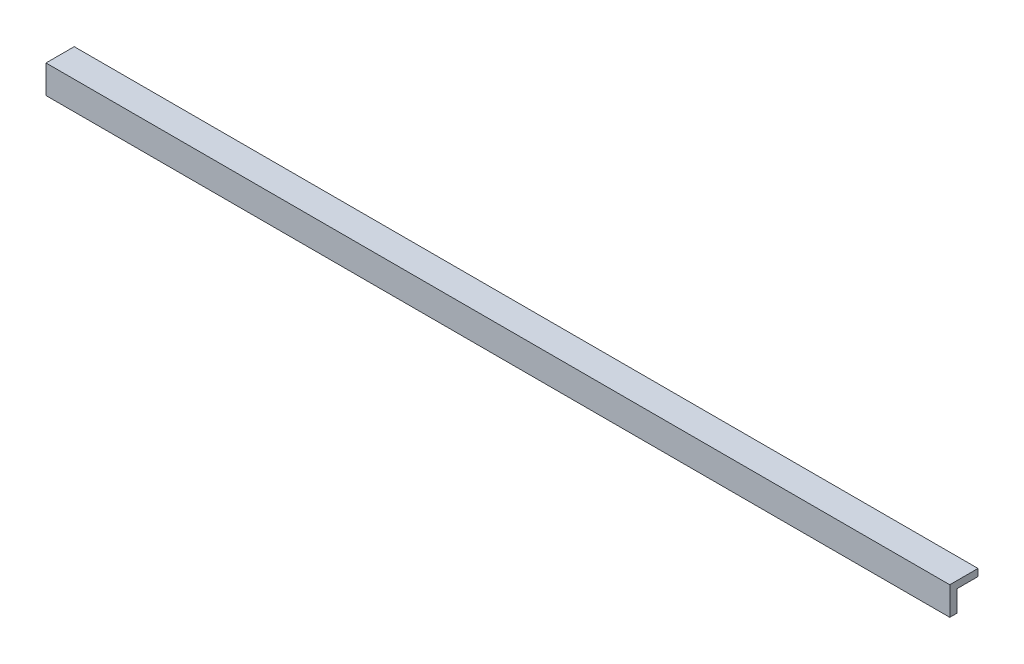
ISO-10303-21;
HEADER;
FILE_DESCRIPTION(('STEP AP214'),'2;1');
FILE_NAME('part.step','',(''),(''),'','','');
FILE_SCHEMA(('AUTOMOTIVE_DESIGN { 1 0 10303 214 1 1 1 1 }'));
ENDSEC;
DATA;
#1=APPLICATION_CONTEXT('core data for automotive mechanical design processes');
#2=APPLICATION_PROTOCOL_DEFINITION('international standard','automotive_design',2000,#1);
#3=PRODUCT_CONTEXT('',#1,'mechanical');
#4=PRODUCT('Part','Part','',(#3));
#5=PRODUCT_RELATED_PRODUCT_CATEGORY('part','',(#4));
#6=PRODUCT_DEFINITION_FORMATION('','',#4);
#7=PRODUCT_DEFINITION_CONTEXT('part definition',#1,'design');
#8=PRODUCT_DEFINITION('design','',#6,#7);
#9=PRODUCT_DEFINITION_SHAPE('','',#8);
#10=(LENGTH_UNIT() NAMED_UNIT(*) SI_UNIT(.MILLI.,.METRE.));
#11=(NAMED_UNIT(*) PLANE_ANGLE_UNIT() SI_UNIT($,.RADIAN.));
#12=(NAMED_UNIT(*) SI_UNIT($,.STERADIAN.) SOLID_ANGLE_UNIT());
#13=UNCERTAINTY_MEASURE_WITH_UNIT(LENGTH_MEASURE(1.E-05),#10,'distance_accuracy_value','');
#14=(GEOMETRIC_REPRESENTATION_CONTEXT(3) GLOBAL_UNCERTAINTY_ASSIGNED_CONTEXT((#13)) GLOBAL_UNIT_ASSIGNED_CONTEXT((#10,
#11,#12)) REPRESENTATION_CONTEXT('',''));
#15=CARTESIAN_POINT('',(0.,0.,0.));
#16=DIRECTION('',(0.,0.,1.));
#17=DIRECTION('',(1.,0.,0.));
#18=AXIS2_PLACEMENT_3D('',#15,#16,#17);
#19=CARTESIAN_POINT('',(203.2,0.,-1.5875));
#20=DIRECTION('',(0.,1.,0.));
#21=DIRECTION('',(0.,0.,1.));
#22=AXIS2_PLACEMENT_3D('',#19,#20,#21);
#23=PLANE('',#22);
#24=DIRECTION('',(0.,0.,-1.));
#25=VECTOR('',#24,1.);
#26=CARTESIAN_POINT('',(0.,0.,-1.5875));
#27=LINE('',#26,#25);
#28=CARTESIAN_POINT('',(0.,0.,0.));
#29=VERTEX_POINT('',#28);
#30=CARTESIAN_POINT('',(0.,0.,-1.5875));
#31=VERTEX_POINT('',#30);
#32=EDGE_CURVE('E143',#29,#31,#27,.T.);
#33=ORIENTED_EDGE('',*,*,#32,.T.);
#34=DIRECTION('',(-1.,0.,0.));
#35=VECTOR('',#34,1.);
#36=CARTESIAN_POINT('',(203.2,0.,-1.5875));
#37=LINE('',#36,#35);
#38=CARTESIAN_POINT('',(203.2,0.,-1.5875));
#39=VERTEX_POINT('',#38);
#40=EDGE_CURVE('E11',#39,#31,#37,.T.);
#41=ORIENTED_EDGE('',*,*,#40,.F.);
#42=DIRECTION('',(0.,0.,-1.));
#43=VECTOR('',#42,1.);
#44=CARTESIAN_POINT('',(203.2,0.,-1.5875));
#45=LINE('',#44,#43);
#46=CARTESIAN_POINT('',(203.2,0.,0.));
#47=VERTEX_POINT('',#46);
#48=EDGE_CURVE('E159',#47,#39,#45,.T.);
#49=ORIENTED_EDGE('',*,*,#48,.F.);
#50=DIRECTION('',(-1.,0.,0.));
#51=VECTOR('',#50,1.);
#52=CARTESIAN_POINT('',(203.2,0.,0.));
#53=LINE('',#52,#51);
#54=EDGE_CURVE('E139',#47,#29,#53,.T.);
#55=ORIENTED_EDGE('',*,*,#54,.T.);
#56=EDGE_LOOP('',(#33,#41,#49,#55));
#57=FACE_BOUND('',#56,.T.);
#58=ADVANCED_FACE('F41',(#57),#23,.F.);
#59=CARTESIAN_POINT('',(203.2,4.7625,-1.5875));
#60=DIRECTION('',(0.,0.,1.));
#61=DIRECTION('',(0.,-1.,0.));
#62=AXIS2_PLACEMENT_3D('',#59,#60,#61);
#63=PLANE('',#62);
#64=DIRECTION('',(0.,1.,0.));
#65=VECTOR('',#64,1.);
#66=CARTESIAN_POINT('',(0.,4.7625,-1.5875));
#67=LINE('',#66,#65);
#68=CARTESIAN_POINT('',(0.,4.7625,-1.5875));
#69=VERTEX_POINT('',#68);
#70=EDGE_CURVE('E147',#31,#69,#67,.T.);
#71=ORIENTED_EDGE('',*,*,#70,.T.);
#72=DIRECTION('',(-1.,0.,0.));
#73=VECTOR('',#72,1.);
#74=CARTESIAN_POINT('',(203.2,4.7625,-1.5875));
#75=LINE('',#74,#73);
#76=CARTESIAN_POINT('',(203.2,4.7625,-1.5875));
#77=VERTEX_POINT('',#76);
#78=EDGE_CURVE('E50',#77,#69,#75,.T.);
#79=ORIENTED_EDGE('',*,*,#78,.F.);
#80=DIRECTION('',(0.,1.,0.));
#81=VECTOR('',#80,1.);
#82=CARTESIAN_POINT('',(203.2,4.7625,-1.5875));
#83=LINE('',#82,#81);
#84=EDGE_CURVE('E106',#39,#77,#83,.T.);
#85=ORIENTED_EDGE('',*,*,#84,.F.);
#86=ORIENTED_EDGE('',*,*,#40,.T.);
#87=EDGE_LOOP('',(#71,#79,#85,#86));
#88=FACE_BOUND('',#87,.T.);
#89=ADVANCED_FACE('F187',(#88),#63,.F.);
#90=CARTESIAN_POINT('',(203.2,4.7625,-6.35));
#91=DIRECTION('',(0.,1.,0.));
#92=DIRECTION('',(0.,0.,1.));
#93=AXIS2_PLACEMENT_3D('',#90,#91,#92);
#94=PLANE('',#93);
#95=DIRECTION('',(0.,0.,-1.));
#96=VECTOR('',#95,1.);
#97=CARTESIAN_POINT('',(0.,4.7625,-6.35));
#98=LINE('',#97,#96);
#99=CARTESIAN_POINT('',(0.,4.7625,-6.35));
#100=VERTEX_POINT('',#99);
#101=EDGE_CURVE('E150',#69,#100,#98,.T.);
#102=ORIENTED_EDGE('',*,*,#101,.T.);
#103=DIRECTION('',(-1.,0.,0.));
#104=VECTOR('',#103,1.);
#105=CARTESIAN_POINT('',(203.2,4.7625,-6.35));
#106=LINE('',#105,#104);
#107=CARTESIAN_POINT('',(203.2,4.7625,-6.35));
#108=VERTEX_POINT('',#107);
#109=EDGE_CURVE('E131',#108,#100,#106,.T.);
#110=ORIENTED_EDGE('',*,*,#109,.F.);
#111=DIRECTION('',(0.,0.,-1.));
#112=VECTOR('',#111,1.);
#113=CARTESIAN_POINT('',(203.2,4.7625,-6.35));
#114=LINE('',#113,#112);
#115=EDGE_CURVE('E120',#77,#108,#114,.T.);
#116=ORIENTED_EDGE('',*,*,#115,.F.);
#117=ORIENTED_EDGE('',*,*,#78,.T.);
#118=EDGE_LOOP('',(#102,#110,#116,#117));
#119=FACE_BOUND('',#118,.T.);
#120=ADVANCED_FACE('F169',(#119),#94,.F.);
#121=CARTESIAN_POINT('',(203.2,6.35,-6.35));
#122=DIRECTION('',(0.,0.,1.));
#123=DIRECTION('',(1.,0.,0.));
#124=AXIS2_PLACEMENT_3D('',#121,#122,#123);
#125=PLANE('',#124);
#126=DIRECTION('',(0.,1.,0.));
#127=VECTOR('',#126,1.);
#128=CARTESIAN_POINT('',(0.,6.35,-6.35));
#129=LINE('',#128,#127);
#130=CARTESIAN_POINT('',(0.,6.35,-6.35));
#131=VERTEX_POINT('',#130);
#132=EDGE_CURVE('E129',#100,#131,#129,.T.);
#133=ORIENTED_EDGE('',*,*,#132,.T.);
#134=DIRECTION('',(-1.,0.,0.));
#135=VECTOR('',#134,1.);
#136=CARTESIAN_POINT('',(203.2,6.35,-6.35));
#137=LINE('',#136,#135);
#138=CARTESIAN_POINT('',(203.2,6.35,-6.35));
#139=VERTEX_POINT('',#138);
#140=EDGE_CURVE('E126',#139,#131,#137,.T.);
#141=ORIENTED_EDGE('',*,*,#140,.F.);
#142=DIRECTION('',(0.,1.,0.));
#143=VECTOR('',#142,1.);
#144=CARTESIAN_POINT('',(203.2,6.35,-6.35));
#145=LINE('',#144,#143);
#146=EDGE_CURVE('E114',#108,#139,#145,.T.);
#147=ORIENTED_EDGE('',*,*,#146,.F.);
#148=ORIENTED_EDGE('',*,*,#109,.T.);
#149=EDGE_LOOP('',(#133,#141,#147,#148));
#150=FACE_BOUND('',#149,.T.);
#151=ADVANCED_FACE('F127',(#150),#125,.F.);
#152=CARTESIAN_POINT('',(203.2,6.35,0.));
#153=DIRECTION('',(0.,-1.,0.));
#154=DIRECTION('',(0.,0.,-1.));
#155=AXIS2_PLACEMENT_3D('',#152,#153,#154);
#156=PLANE('',#155);
#157=DIRECTION('',(0.,0.,1.));
#158=VECTOR('',#157,1.);
#159=CARTESIAN_POINT('',(0.,6.35,0.));
#160=LINE('',#159,#158);
#161=CARTESIAN_POINT('',(0.,6.35,0.));
#162=VERTEX_POINT('',#161);
#163=EDGE_CURVE('E89',#131,#162,#160,.T.);
#164=ORIENTED_EDGE('',*,*,#163,.T.);
#165=DIRECTION('',(-1.,0.,0.));
#166=VECTOR('',#165,1.);
#167=CARTESIAN_POINT('',(203.2,6.35,0.));
#168=LINE('',#167,#166);
#169=CARTESIAN_POINT('',(203.2,6.35,0.));
#170=VERTEX_POINT('',#169);
#171=EDGE_CURVE('E132',#170,#162,#168,.T.);
#172=ORIENTED_EDGE('',*,*,#171,.F.);
#173=DIRECTION('',(0.,0.,1.));
#174=VECTOR('',#173,1.);
#175=CARTESIAN_POINT('',(203.2,6.35,0.));
#176=LINE('',#175,#174);
#177=EDGE_CURVE('E118',#139,#170,#176,.T.);
#178=ORIENTED_EDGE('',*,*,#177,.F.);
#179=ORIENTED_EDGE('',*,*,#140,.T.);
#180=EDGE_LOOP('',(#164,#172,#178,#179));
#181=FACE_BOUND('',#180,.T.);
#182=ADVANCED_FACE('F134',(#181),#156,.F.);
#183=CARTESIAN_POINT('',(203.2,0.,0.));
#184=DIRECTION('',(0.,0.,-1.));
#185=DIRECTION('',(-1.,0.,0.));
#186=AXIS2_PLACEMENT_3D('',#183,#184,#185);
#187=PLANE('',#186);
#188=DIRECTION('',(0.,-1.,0.));
#189=VECTOR('',#188,1.);
#190=CARTESIAN_POINT('',(0.,0.,0.));
#191=LINE('',#190,#189);
#192=EDGE_CURVE('E96',#162,#29,#191,.T.);
#193=ORIENTED_EDGE('',*,*,#192,.T.);
#194=ORIENTED_EDGE('',*,*,#54,.F.);
#195=DIRECTION('',(0.,-1.,0.));
#196=VECTOR('',#195,1.);
#197=CARTESIAN_POINT('',(203.2,0.,0.));
#198=LINE('',#197,#196);
#199=EDGE_CURVE('E61',#170,#47,#198,.T.);
#200=ORIENTED_EDGE('',*,*,#199,.F.);
#201=ORIENTED_EDGE('',*,*,#171,.T.);
#202=EDGE_LOOP('',(#193,#194,#200,#201));
#203=FACE_BOUND('',#202,.T.);
#204=ADVANCED_FACE('F176',(#203),#187,.F.);
#205=CARTESIAN_POINT('',(203.2,0.,0.));
#206=DIRECTION('',(-1.,0.,0.));
#207=DIRECTION('',(0.,0.,1.));
#208=AXIS2_PLACEMENT_3D('',#205,#206,#207);
#209=PLANE('',#208);
#210=ORIENTED_EDGE('',*,*,#48,.T.);
#211=ORIENTED_EDGE('',*,*,#84,.T.);
#212=ORIENTED_EDGE('',*,*,#115,.T.);
#213=ORIENTED_EDGE('',*,*,#146,.T.);
#214=ORIENTED_EDGE('',*,*,#177,.T.);
#215=ORIENTED_EDGE('',*,*,#199,.T.);
#216=EDGE_LOOP('',(#210,#211,#212,#213,#214,#215));
#217=FACE_BOUND('',#216,.T.);
#218=ADVANCED_FACE('F116',(#217),#209,.F.);
#219=CARTESIAN_POINT('',(0.,0.,0.));
#220=DIRECTION('',(-1.,0.,0.));
#221=DIRECTION('',(0.,0.,1.));
#222=AXIS2_PLACEMENT_3D('',#219,#220,#221);
#223=PLANE('',#222);
#224=ORIENTED_EDGE('',*,*,#32,.F.);
#225=ORIENTED_EDGE('',*,*,#192,.F.);
#226=ORIENTED_EDGE('',*,*,#163,.F.);
#227=ORIENTED_EDGE('',*,*,#132,.F.);
#228=ORIENTED_EDGE('',*,*,#101,.F.);
#229=ORIENTED_EDGE('',*,*,#70,.F.);
#230=EDGE_LOOP('',(#224,#225,#226,#227,#228,#229));
#231=FACE_BOUND('',#230,.T.);
#232=ADVANCED_FACE('F172',(#231),#223,.T.);
#233=CLOSED_SHELL('',(#58,#89,#120,#151,#182,#204,#218,#232));
#234=MANIFOLD_SOLID_BREP('B2',#233);
#235=ADVANCED_BREP_SHAPE_REPRESENTATION('',(#18,#234),#14);
#236=SHAPE_DEFINITION_REPRESENTATION(#9,#235);
ENDSEC;
END-ISO-10303-21;
